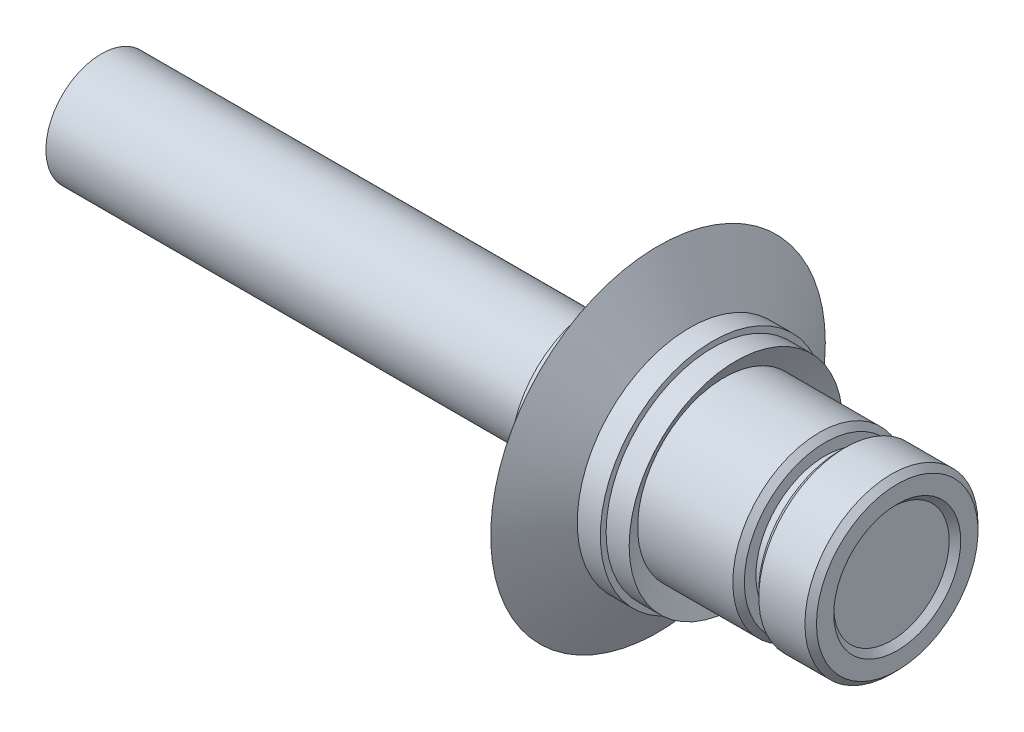
ISO-10303-21;
HEADER;
FILE_DESCRIPTION(('STEP AP214'),'2;1');
FILE_NAME('part.step','',(''),(''),'','','');
FILE_SCHEMA(('AUTOMOTIVE_DESIGN { 1 0 10303 214 1 1 1 1 }'));
ENDSEC;
DATA;
#1=APPLICATION_CONTEXT('core data for automotive mechanical design processes');
#2=APPLICATION_PROTOCOL_DEFINITION('international standard','automotive_design',2000,#1);
#3=PRODUCT_CONTEXT('',#1,'mechanical');
#4=PRODUCT('Part','Part','',(#3));
#5=PRODUCT_RELATED_PRODUCT_CATEGORY('part','',(#4));
#6=PRODUCT_DEFINITION_FORMATION('','',#4);
#7=PRODUCT_DEFINITION_CONTEXT('part definition',#1,'design');
#8=PRODUCT_DEFINITION('design','',#6,#7);
#9=PRODUCT_DEFINITION_SHAPE('','',#8);
#10=(LENGTH_UNIT() NAMED_UNIT(*) SI_UNIT(.MILLI.,.METRE.));
#11=(NAMED_UNIT(*) PLANE_ANGLE_UNIT() SI_UNIT($,.RADIAN.));
#12=(NAMED_UNIT(*) SI_UNIT($,.STERADIAN.) SOLID_ANGLE_UNIT());
#13=UNCERTAINTY_MEASURE_WITH_UNIT(LENGTH_MEASURE(1.E-05),#10,'distance_accuracy_value','');
#14=(GEOMETRIC_REPRESENTATION_CONTEXT(3) GLOBAL_UNCERTAINTY_ASSIGNED_CONTEXT((#13)) GLOBAL_UNIT_ASSIGNED_CONTEXT((#10,
#11,#12)) REPRESENTATION_CONTEXT('',''));
#15=CARTESIAN_POINT('',(0.,0.,0.));
#16=DIRECTION('',(0.,0.,1.));
#17=DIRECTION('',(1.,0.,0.));
#18=AXIS2_PLACEMENT_3D('',#15,#16,#17);
#19=CARTESIAN_POINT('',(313.5,-9.6,0.));
#20=DIRECTION('',(1.,0.,0.));
#21=DIRECTION('',(0.,0.,-1.));
#22=AXIS2_PLACEMENT_3D('',#19,#20,#21);
#23=PLANE('',#22);
#24=CARTESIAN_POINT('',(313.5,0.,0.));
#25=DIRECTION('',(1.,0.,0.));
#26=DIRECTION('',(0.,0.,-1.));
#27=AXIS2_PLACEMENT_3D('',#24,#25,#26);
#28=CIRCLE('',#27,9.6);
#29=CARTESIAN_POINT('',(313.5,0.,-9.6));
#30=VERTEX_POINT('',#29);
#31=EDGE_CURVE('E108',#30,#30,#28,.T.);
#32=ORIENTED_EDGE('',*,*,#31,.F.);
#33=EDGE_LOOP('',(#32));
#34=FACE_BOUND('',#33,.T.);
#35=CARTESIAN_POINT('',(313.5,0.,0.));
#36=DIRECTION('',(1.,0.,0.));
#37=DIRECTION('',(0.,0.,-1.));
#38=AXIS2_PLACEMENT_3D('',#35,#36,#37);
#39=CIRCLE('',#38,7.6);
#40=CARTESIAN_POINT('',(313.5,0.,-7.6));
#41=VERTEX_POINT('',#40);
#42=EDGE_CURVE('E64',#41,#41,#39,.T.);
#43=ORIENTED_EDGE('',*,*,#42,.T.);
#44=EDGE_LOOP('',(#43));
#45=FACE_BOUND('',#44,.T.);
#46=ADVANCED_FACE('F35',(#34,#45),#23,.F.);
#47=CARTESIAN_POINT('',(313.5,0.,0.));
#48=DIRECTION('',(1.,0.,0.));
#49=DIRECTION('',(0.,0.,-1.));
#50=AXIS2_PLACEMENT_3D('',#47,#48,#49);
#51=CYLINDRICAL_SURFACE('',#50,7.6);
#52=ORIENTED_EDGE('',*,*,#42,.F.);
#53=EDGE_LOOP('',(#52));
#54=FACE_BOUND('',#53,.T.);
#55=CARTESIAN_POINT('',(316.5,0.,0.));
#56=DIRECTION('',(1.,0.,0.));
#57=DIRECTION('',(0.,0.,-1.));
#58=AXIS2_PLACEMENT_3D('',#55,#56,#57);
#59=CIRCLE('',#58,7.6);
#60=CARTESIAN_POINT('',(316.5,0.,-7.6));
#61=VERTEX_POINT('',#60);
#62=EDGE_CURVE('E68',#61,#61,#59,.T.);
#63=ORIENTED_EDGE('',*,*,#62,.T.);
#64=EDGE_LOOP('',(#63));
#65=FACE_BOUND('',#64,.T.);
#66=ADVANCED_FACE('F117',(#54,#65),#51,.F.);
#67=CARTESIAN_POINT('',(316.5,-7.6,0.));
#68=DIRECTION('',(1.,0.,0.));
#69=DIRECTION('',(0.,0.,-1.));
#70=AXIS2_PLACEMENT_3D('',#67,#68,#69);
#71=PLANE('',#70);
#72=ORIENTED_EDGE('',*,*,#62,.F.);
#73=EDGE_LOOP('',(#72));
#74=FACE_BOUND('',#73,.T.);
#75=ADVANCED_FACE('F123',(#74),#71,.F.);
#76=CARTESIAN_POINT('',(450.464577224652,-10.,0.));
#77=DIRECTION('',(-1.,0.,0.));
#78=DIRECTION('',(0.,0.,1.));
#79=AXIS2_PLACEMENT_3D('',#76,#77,#78);
#80=PLANE('',#79);
#81=CARTESIAN_POINT('',(450.464577224652,0.,0.));
#82=DIRECTION('',(1.,0.,0.));
#83=DIRECTION('',(0.,0.,-1.));
#84=AXIS2_PLACEMENT_3D('',#81,#82,#83);
#85=CIRCLE('',#84,10.);
#86=CARTESIAN_POINT('',(450.464577224652,0.,-10.));
#87=VERTEX_POINT('',#86);
#88=EDGE_CURVE('E72',#87,#87,#85,.T.);
#89=ORIENTED_EDGE('',*,*,#88,.T.);
#90=EDGE_LOOP('',(#89));
#91=FACE_BOUND('',#90,.T.);
#92=ADVANCED_FACE('F128',(#91),#80,.F.);
#93=CARTESIAN_POINT('',(451.464577224652,-10.,0.));
#94=DIRECTION('',(-1.,0.,0.));
#95=DIRECTION('',(0.,0.,1.));
#96=AXIS2_PLACEMENT_3D('',#93,#94,#95);
#97=PLANE('',#96);
#98=CARTESIAN_POINT('',(451.464577224652,0.,0.));
#99=DIRECTION('',(-1.,0.,0.));
#100=DIRECTION('',(0.,0.,1.));
#101=AXIS2_PLACEMENT_3D('',#98,#99,#100);
#102=CIRCLE('',#101,14.);
#103=CARTESIAN_POINT('',(451.464577224652,0.,14.));
#104=VERTEX_POINT('',#103);
#105=EDGE_CURVE('E10',#104,#104,#102,.F.);
#106=ORIENTED_EDGE('',*,*,#105,.T.);
#107=EDGE_LOOP('',(#106));
#108=FACE_BOUND('',#107,.T.);
#109=CARTESIAN_POINT('',(451.464577224652,0.,0.));
#110=DIRECTION('',(-1.,0.,0.));
#111=DIRECTION('',(0.,0.,1.));
#112=AXIS2_PLACEMENT_3D('',#109,#110,#111);
#113=CIRCLE('',#112,11.);
#114=CARTESIAN_POINT('',(451.464577224652,0.,11.));
#115=VERTEX_POINT('',#114);
#116=EDGE_CURVE('E42',#115,#115,#113,.T.);
#117=ORIENTED_EDGE('',*,*,#116,.T.);
#118=EDGE_LOOP('',(#117));
#119=FACE_BOUND('',#118,.T.);
#120=ADVANCED_FACE('F133',(#108,#119),#97,.F.);
#121=CARTESIAN_POINT('',(313.5,0.,0.));
#122=DIRECTION('',(1.,0.,0.));
#123=DIRECTION('',(0.,0.,-1.));
#124=AXIS2_PLACEMENT_3D('',#121,#122,#123);
#125=CYLINDRICAL_SURFACE('',#124,15.);
#126=CARTESIAN_POINT('',(442.464577224652,0.,0.));
#127=DIRECTION('',(1.,0.,0.));
#128=DIRECTION('',(0.,0.,-1.));
#129=AXIS2_PLACEMENT_3D('',#126,#127,#128);
#130=CIRCLE('',#129,15.);
#131=CARTESIAN_POINT('',(442.464577224652,0.,-15.));
#132=VERTEX_POINT('',#131);
#133=EDGE_CURVE('E50',#132,#132,#130,.T.);
#134=ORIENTED_EDGE('',*,*,#133,.T.);
#135=EDGE_LOOP('',(#134));
#136=FACE_BOUND('',#135,.T.);
#137=CARTESIAN_POINT('',(450.464577224652,0.,0.));
#138=DIRECTION('',(-1.,0.,0.));
#139=DIRECTION('',(0.,0.,1.));
#140=AXIS2_PLACEMENT_3D('',#137,#138,#139);
#141=CIRCLE('',#140,15.);
#142=CARTESIAN_POINT('',(450.464577224652,0.,15.));
#143=VERTEX_POINT('',#142);
#144=EDGE_CURVE('E55',#143,#143,#141,.T.);
#145=ORIENTED_EDGE('',*,*,#144,.T.);
#146=EDGE_LOOP('',(#145));
#147=FACE_BOUND('',#146,.T.);
#148=ADVANCED_FACE('F155',(#136,#147),#125,.T.);
#149=CARTESIAN_POINT('',(441.464577224652,-12.,0.));
#150=DIRECTION('',(1.,0.,0.));
#151=DIRECTION('',(0.,0.,-1.));
#152=AXIS2_PLACEMENT_3D('',#149,#150,#151);
#153=PLANE('',#152);
#154=CARTESIAN_POINT('',(441.464577224652,0.,0.));
#155=DIRECTION('',(1.,0.,0.));
#156=DIRECTION('',(0.,0.,-1.));
#157=AXIS2_PLACEMENT_3D('',#154,#155,#156);
#158=CIRCLE('',#157,14.);
#159=CARTESIAN_POINT('',(441.464577224652,0.,-14.));
#160=VERTEX_POINT('',#159);
#161=EDGE_CURVE('E46',#160,#160,#158,.F.);
#162=ORIENTED_EDGE('',*,*,#161,.T.);
#163=EDGE_LOOP('',(#162));
#164=FACE_BOUND('',#163,.T.);
#165=CARTESIAN_POINT('',(441.464577224652,0.,0.));
#166=DIRECTION('',(1.,0.,0.));
#167=DIRECTION('',(0.,0.,-1.));
#168=AXIS2_PLACEMENT_3D('',#165,#166,#167);
#169=CIRCLE('',#168,12.);
#170=CARTESIAN_POINT('',(441.464577224652,0.,-12.));
#171=VERTEX_POINT('',#170);
#172=EDGE_CURVE('E75',#171,#171,#169,.T.);
#173=ORIENTED_EDGE('',*,*,#172,.T.);
#174=EDGE_LOOP('',(#173));
#175=FACE_BOUND('',#174,.T.);
#176=ADVANCED_FACE('F157',(#164,#175),#153,.F.);
#177=CARTESIAN_POINT('',(313.5,0.,0.));
#178=DIRECTION('',(1.,0.,0.));
#179=DIRECTION('',(0.,0.,-1.));
#180=AXIS2_PLACEMENT_3D('',#177,#178,#179);
#181=CYLINDRICAL_SURFACE('',#180,12.);
#182=ORIENTED_EDGE('',*,*,#172,.F.);
#183=EDGE_LOOP('',(#182));
#184=FACE_BOUND('',#183,.T.);
#185=CARTESIAN_POINT('',(438.964577224652,0.,0.));
#186=DIRECTION('',(1.,0.,0.));
#187=DIRECTION('',(0.,0.,-1.));
#188=AXIS2_PLACEMENT_3D('',#185,#186,#187);
#189=CIRCLE('',#188,12.);
#190=CARTESIAN_POINT('',(438.964577224652,0.,-12.));
#191=VERTEX_POINT('',#190);
#192=EDGE_CURVE('E78',#191,#191,#189,.T.);
#193=ORIENTED_EDGE('',*,*,#192,.T.);
#194=EDGE_LOOP('',(#193));
#195=FACE_BOUND('',#194,.T.);
#196=ADVANCED_FACE('F164',(#184,#195),#181,.T.);
#197=CARTESIAN_POINT('',(438.964577224652,-15.,0.));
#198=DIRECTION('',(-1.,0.,0.));
#199=DIRECTION('',(0.,0.,1.));
#200=AXIS2_PLACEMENT_3D('',#197,#198,#199);
#201=PLANE('',#200);
#202=CARTESIAN_POINT('',(438.964577224652,0.,0.));
#203=DIRECTION('',(-1.,0.,0.));
#204=DIRECTION('',(0.,0.,1.));
#205=AXIS2_PLACEMENT_3D('',#202,#203,#204);
#206=CIRCLE('',#205,14.);
#207=CARTESIAN_POINT('',(438.964577224652,0.,14.));
#208=VERTEX_POINT('',#207);
#209=EDGE_CURVE('E61',#208,#208,#206,.F.);
#210=ORIENTED_EDGE('',*,*,#209,.T.);
#211=EDGE_LOOP('',(#210));
#212=FACE_BOUND('',#211,.T.);
#213=ORIENTED_EDGE('',*,*,#192,.F.);
#214=EDGE_LOOP('',(#213));
#215=FACE_BOUND('',#214,.T.);
#216=ADVANCED_FACE('F170',(#212,#215),#201,.F.);
#217=CARTESIAN_POINT('',(313.5,0.,0.));
#218=DIRECTION('',(1.,0.,0.));
#219=DIRECTION('',(0.,0.,-1.));
#220=AXIS2_PLACEMENT_3D('',#217,#218,#219);
#221=CYLINDRICAL_SURFACE('',#220,15.);
#222=CARTESIAN_POINT('',(437.964577224652,0.,0.));
#223=DIRECTION('',(-1.,0.,0.));
#224=DIRECTION('',(0.,0.,1.));
#225=AXIS2_PLACEMENT_3D('',#222,#223,#224);
#226=CIRCLE('',#225,15.);
#227=CARTESIAN_POINT('',(437.964577224652,0.,15.));
#228=VERTEX_POINT('',#227);
#229=EDGE_CURVE('E58',#228,#228,#226,.T.);
#230=ORIENTED_EDGE('',*,*,#229,.T.);
#231=EDGE_LOOP('',(#230));
#232=FACE_BOUND('',#231,.T.);
#233=CARTESIAN_POINT('',(421.464577224652,0.,0.));
#234=DIRECTION('',(1.,0.,0.));
#235=DIRECTION('',(0.,0.,-1.));
#236=AXIS2_PLACEMENT_3D('',#233,#234,#235);
#237=CIRCLE('',#236,15.);
#238=CARTESIAN_POINT('',(421.464577224652,0.,-15.));
#239=VERTEX_POINT('',#238);
#240=EDGE_CURVE('E81',#239,#239,#237,.T.);
#241=ORIENTED_EDGE('',*,*,#240,.T.);
#242=EDGE_LOOP('',(#241));
#243=FACE_BOUND('',#242,.T.);
#244=ADVANCED_FACE('F174',(#232,#243),#221,.T.);
#245=CARTESIAN_POINT('',(423.5,0.,0.));
#246=DIRECTION('',(1.,0.,0.));
#247=DIRECTION('',(0.,0.,-1.));
#248=AXIS2_PLACEMENT_3D('',#245,#246,#247);
#249=CONICAL_SURFACE('',#248,18.5,1.04405395605218);
#250=ORIENTED_EDGE('',*,*,#240,.F.);
#251=EDGE_LOOP('',(#250));
#252=FACE_BOUND('',#251,.T.);
#253=CARTESIAN_POINT('',(423.5,0.,0.));
#254=DIRECTION('',(1.,0.,0.));
#255=DIRECTION('',(0.,0.,-1.));
#256=AXIS2_PLACEMENT_3D('',#253,#254,#255);
#257=CIRCLE('',#256,18.5);
#258=CARTESIAN_POINT('',(423.5,0.,-18.5));
#259=VERTEX_POINT('',#258);
#260=EDGE_CURVE('E84',#259,#259,#257,.T.);
#261=ORIENTED_EDGE('',*,*,#260,.T.);
#262=EDGE_LOOP('',(#261));
#263=FACE_BOUND('',#262,.T.);
#264=ADVANCED_FACE('F178',(#252,#263),#249,.F.);
#265=CARTESIAN_POINT('',(313.5,0.,0.));
#266=DIRECTION('',(1.,0.,0.));
#267=DIRECTION('',(0.,0.,-1.));
#268=AXIS2_PLACEMENT_3D('',#265,#266,#267);
#269=CYLINDRICAL_SURFACE('',#268,18.5);
#270=ORIENTED_EDGE('',*,*,#260,.F.);
#271=EDGE_LOOP('',(#270));
#272=FACE_BOUND('',#271,.T.);
#273=CARTESIAN_POINT('',(419.5,0.,0.));
#274=DIRECTION('',(1.,0.,0.));
#275=DIRECTION('',(0.,0.,-1.));
#276=AXIS2_PLACEMENT_3D('',#273,#274,#275);
#277=CIRCLE('',#276,18.5);
#278=CARTESIAN_POINT('',(419.5,0.,-18.5));
#279=VERTEX_POINT('',#278);
#280=EDGE_CURVE('E87',#279,#279,#277,.T.);
#281=ORIENTED_EDGE('',*,*,#280,.T.);
#282=EDGE_LOOP('',(#281));
#283=FACE_BOUND('',#282,.T.);
#284=ADVANCED_FACE('F182',(#272,#283),#269,.T.);
#285=CARTESIAN_POINT('',(419.5,-18.5,0.));
#286=DIRECTION('',(-1.,0.,0.));
#287=DIRECTION('',(0.,0.,1.));
#288=AXIS2_PLACEMENT_3D('',#285,#286,#287);
#289=PLANE('',#288);
#290=ORIENTED_EDGE('',*,*,#280,.F.);
#291=EDGE_LOOP('',(#290));
#292=FACE_BOUND('',#291,.T.);
#293=CARTESIAN_POINT('',(419.5,0.,0.));
#294=DIRECTION('',(1.,0.,0.));
#295=DIRECTION('',(0.,0.,-1.));
#296=AXIS2_PLACEMENT_3D('',#293,#294,#295);
#297=CIRCLE('',#296,19.5);
#298=CARTESIAN_POINT('',(419.5,0.,-19.5));
#299=VERTEX_POINT('',#298);
#300=EDGE_CURVE('E90',#299,#299,#297,.T.);
#301=ORIENTED_EDGE('',*,*,#300,.T.);
#302=EDGE_LOOP('',(#301));
#303=FACE_BOUND('',#302,.T.);
#304=ADVANCED_FACE('F186',(#292,#303),#289,.F.);
#305=CARTESIAN_POINT('',(313.5,0.,0.));
#306=DIRECTION('',(1.,0.,0.));
#307=DIRECTION('',(0.,0.,-1.));
#308=AXIS2_PLACEMENT_3D('',#305,#306,#307);
#309=CYLINDRICAL_SURFACE('',#308,19.5);
#310=ORIENTED_EDGE('',*,*,#300,.F.);
#311=EDGE_LOOP('',(#310));
#312=FACE_BOUND('',#311,.T.);
#313=CARTESIAN_POINT('',(415.5,0.,0.));
#314=DIRECTION('',(1.,0.,0.));
#315=DIRECTION('',(0.,0.,-1.));
#316=AXIS2_PLACEMENT_3D('',#313,#314,#315);
#317=CIRCLE('',#316,19.5);
#318=CARTESIAN_POINT('',(415.5,0.,-19.5));
#319=VERTEX_POINT('',#318);
#320=EDGE_CURVE('E93',#319,#319,#317,.T.);
#321=ORIENTED_EDGE('',*,*,#320,.T.);
#322=EDGE_LOOP('',(#321));
#323=FACE_BOUND('',#322,.T.);
#324=ADVANCED_FACE('F190',(#312,#323),#309,.T.);
#325=CARTESIAN_POINT('',(410.,0.,0.));
#326=DIRECTION('',(-1.,0.,0.));
#327=DIRECTION('',(0.,0.,1.));
#328=AXIS2_PLACEMENT_3D('',#325,#326,#327);
#329=CONICAL_SURFACE('',#328,29.,1.04600055514479);
#330=ORIENTED_EDGE('',*,*,#320,.F.);
#331=EDGE_LOOP('',(#330));
#332=FACE_BOUND('',#331,.T.);
#333=CARTESIAN_POINT('',(410.,0.,0.));
#334=DIRECTION('',(1.,0.,0.));
#335=DIRECTION('',(0.,0.,-1.));
#336=AXIS2_PLACEMENT_3D('',#333,#334,#335);
#337=CIRCLE('',#336,29.);
#338=CARTESIAN_POINT('',(410.,0.,-29.));
#339=VERTEX_POINT('',#338);
#340=EDGE_CURVE('E96',#339,#339,#337,.T.);
#341=ORIENTED_EDGE('',*,*,#340,.T.);
#342=EDGE_LOOP('',(#341));
#343=FACE_BOUND('',#342,.T.);
#344=ADVANCED_FACE('F194',(#332,#343),#329,.T.);
#345=CARTESIAN_POINT('',(410.,-29.,0.));
#346=DIRECTION('',(1.,0.,0.));
#347=DIRECTION('',(0.,0.,-1.));
#348=AXIS2_PLACEMENT_3D('',#345,#346,#347);
#349=PLANE('',#348);
#350=ORIENTED_EDGE('',*,*,#340,.F.);
#351=EDGE_LOOP('',(#350));
#352=FACE_BOUND('',#351,.T.);
#353=CARTESIAN_POINT('',(410.,0.,0.));
#354=DIRECTION('',(1.,0.,0.));
#355=DIRECTION('',(0.,0.,-1.));
#356=AXIS2_PLACEMENT_3D('',#353,#354,#355);
#357=CIRCLE('',#356,15.);
#358=CARTESIAN_POINT('',(410.,0.,-15.));
#359=VERTEX_POINT('',#358);
#360=EDGE_CURVE('E99',#359,#359,#357,.T.);
#361=ORIENTED_EDGE('',*,*,#360,.T.);
#362=EDGE_LOOP('',(#361));
#363=FACE_BOUND('',#362,.T.);
#364=ADVANCED_FACE('F198',(#352,#363),#349,.F.);
#365=CARTESIAN_POINT('',(313.5,0.,0.));
#366=DIRECTION('',(1.,0.,0.));
#367=DIRECTION('',(0.,0.,-1.));
#368=AXIS2_PLACEMENT_3D('',#365,#366,#367);
#369=CYLINDRICAL_SURFACE('',#368,15.);
#370=ORIENTED_EDGE('',*,*,#360,.F.);
#371=EDGE_LOOP('',(#370));
#372=FACE_BOUND('',#371,.T.);
#373=CARTESIAN_POINT('',(399.5,0.,0.));
#374=DIRECTION('',(1.,0.,0.));
#375=DIRECTION('',(0.,0.,-1.));
#376=AXIS2_PLACEMENT_3D('',#373,#374,#375);
#377=CIRCLE('',#376,15.);
#378=CARTESIAN_POINT('',(399.5,0.,-15.));
#379=VERTEX_POINT('',#378);
#380=EDGE_CURVE('E102',#379,#379,#377,.T.);
#381=ORIENTED_EDGE('',*,*,#380,.T.);
#382=EDGE_LOOP('',(#381));
#383=FACE_BOUND('',#382,.T.);
#384=ADVANCED_FACE('F202',(#372,#383),#369,.T.);
#385=CARTESIAN_POINT('',(399.5,-15.,0.));
#386=DIRECTION('',(1.,0.,0.));
#387=DIRECTION('',(0.,0.,-1.));
#388=AXIS2_PLACEMENT_3D('',#385,#386,#387);
#389=PLANE('',#388);
#390=ORIENTED_EDGE('',*,*,#380,.F.);
#391=EDGE_LOOP('',(#390));
#392=FACE_BOUND('',#391,.T.);
#393=CARTESIAN_POINT('',(399.5,0.,0.));
#394=DIRECTION('',(1.,0.,0.));
#395=DIRECTION('',(0.,0.,-1.));
#396=AXIS2_PLACEMENT_3D('',#393,#394,#395);
#397=CIRCLE('',#396,9.6);
#398=CARTESIAN_POINT('',(399.5,0.,-9.6));
#399=VERTEX_POINT('',#398);
#400=EDGE_CURVE('E105',#399,#399,#397,.T.);
#401=ORIENTED_EDGE('',*,*,#400,.T.);
#402=EDGE_LOOP('',(#401));
#403=FACE_BOUND('',#402,.T.);
#404=ADVANCED_FACE('F206',(#392,#403),#389,.F.);
#405=CARTESIAN_POINT('',(313.5,0.,0.));
#406=DIRECTION('',(1.,0.,0.));
#407=DIRECTION('',(0.,0.,-1.));
#408=AXIS2_PLACEMENT_3D('',#405,#406,#407);
#409=CYLINDRICAL_SURFACE('',#408,9.6);
#410=ORIENTED_EDGE('',*,*,#400,.F.);
#411=EDGE_LOOP('',(#410));
#412=FACE_BOUND('',#411,.T.);
#413=ORIENTED_EDGE('',*,*,#31,.T.);
#414=EDGE_LOOP('',(#413));
#415=FACE_BOUND('',#414,.T.);
#416=ADVANCED_FACE('F113',(#412,#415),#409,.T.);
#417=CARTESIAN_POINT('',(438.964577224652,0.,0.));
#418=DIRECTION('',(-1.,0.,0.));
#419=DIRECTION('',(0.,0.,1.));
#420=AXIS2_PLACEMENT_3D('',#417,#418,#419);
#421=CONICAL_SURFACE('',#420,14.,0.785398163397442);
#422=ORIENTED_EDGE('',*,*,#229,.F.);
#423=EDGE_LOOP('',(#422));
#424=FACE_BOUND('',#423,.T.);
#425=ORIENTED_EDGE('',*,*,#209,.F.);
#426=EDGE_LOOP('',(#425));
#427=FACE_BOUND('',#426,.T.);
#428=ADVANCED_FACE('F138',(#424,#427),#421,.T.);
#429=CARTESIAN_POINT('',(442.464577224652,0.,0.));
#430=DIRECTION('',(1.,0.,0.));
#431=DIRECTION('',(0.,0.,-1.));
#432=AXIS2_PLACEMENT_3D('',#429,#430,#431);
#433=CONICAL_SURFACE('',#432,15.,0.785398163397449);
#434=ORIENTED_EDGE('',*,*,#161,.F.);
#435=EDGE_LOOP('',(#434));
#436=FACE_BOUND('',#435,.T.);
#437=ORIENTED_EDGE('',*,*,#133,.F.);
#438=EDGE_LOOP('',(#437));
#439=FACE_BOUND('',#438,.T.);
#440=ADVANCED_FACE('F141',(#436,#439),#433,.T.);
#441=CARTESIAN_POINT('',(451.464577224652,0.,0.));
#442=DIRECTION('',(-1.,0.,0.));
#443=DIRECTION('',(0.,0.,1.));
#444=AXIS2_PLACEMENT_3D('',#441,#442,#443);
#445=CONICAL_SURFACE('',#444,14.,0.785398163397415);
#446=ORIENTED_EDGE('',*,*,#144,.F.);
#447=EDGE_LOOP('',(#446));
#448=FACE_BOUND('',#447,.T.);
#449=ORIENTED_EDGE('',*,*,#105,.F.);
#450=EDGE_LOOP('',(#449));
#451=FACE_BOUND('',#450,.T.);
#452=ADVANCED_FACE('F144',(#448,#451),#445,.T.);
#453=CARTESIAN_POINT('',(450.464577224652,0.,0.));
#454=DIRECTION('',(1.,0.,0.));
#455=DIRECTION('',(0.,0.,-1.));
#456=AXIS2_PLACEMENT_3D('',#453,#454,#455);
#457=CONICAL_SURFACE('',#456,10.,0.785398163397459);
#458=ORIENTED_EDGE('',*,*,#116,.F.);
#459=EDGE_LOOP('',(#458));
#460=FACE_BOUND('',#459,.T.);
#461=ORIENTED_EDGE('',*,*,#88,.F.);
#462=EDGE_LOOP('',(#461));
#463=FACE_BOUND('',#462,.T.);
#464=ADVANCED_FACE('F37',(#460,#463),#457,.F.);
#465=CLOSED_SHELL('',(#46,#66,#75,#92,#120,#148,#176,#196,#216,#244,#264,#284,#304,#324,#344,
#364,#384,#404,#416,#428,#440,#452,#464));
#466=MANIFOLD_SOLID_BREP('B2',#465);
#467=ADVANCED_BREP_SHAPE_REPRESENTATION('',(#18,#466),#14);
#468=SHAPE_DEFINITION_REPRESENTATION(#9,#467);
ENDSEC;
END-ISO-10303-21;
